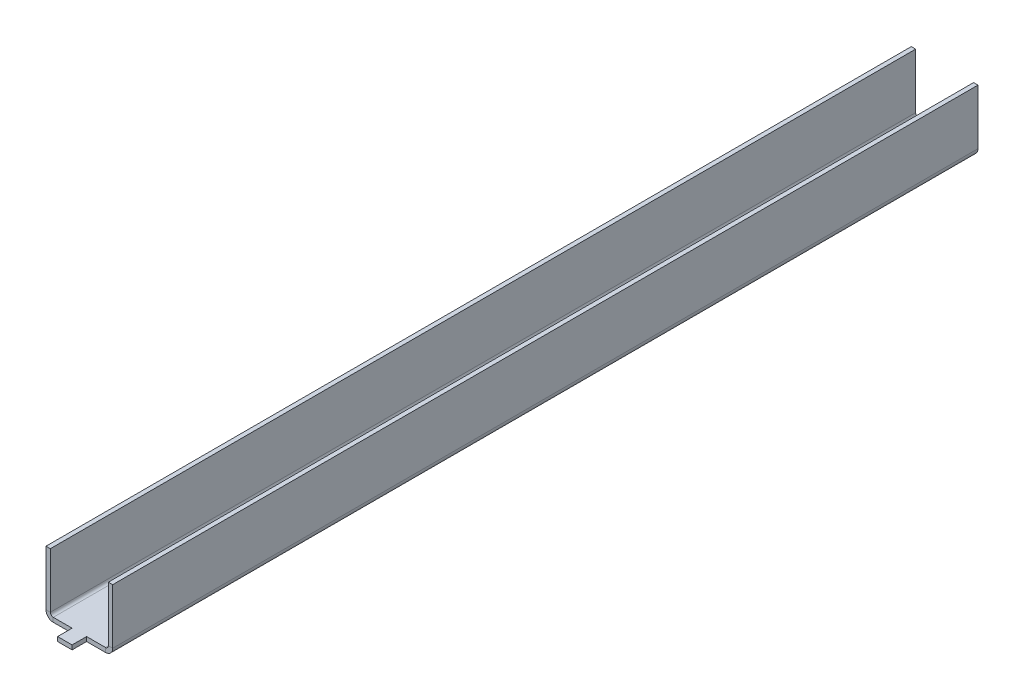
ISO-10303-21;
HEADER;
FILE_DESCRIPTION(('STEP AP214'),'2;1');
FILE_NAME('part.step','',(''),(''),'','','');
FILE_SCHEMA(('AUTOMOTIVE_DESIGN { 1 0 10303 214 1 1 1 1 }'));
ENDSEC;
DATA;
#1=APPLICATION_CONTEXT('core data for automotive mechanical design processes');
#2=APPLICATION_PROTOCOL_DEFINITION('international standard','automotive_design',2000,#1);
#3=PRODUCT_CONTEXT('',#1,'mechanical');
#4=PRODUCT('Part','Part','',(#3));
#5=PRODUCT_RELATED_PRODUCT_CATEGORY('part','',(#4));
#6=PRODUCT_DEFINITION_FORMATION('','',#4);
#7=PRODUCT_DEFINITION_CONTEXT('part definition',#1,'design');
#8=PRODUCT_DEFINITION('design','',#6,#7);
#9=PRODUCT_DEFINITION_SHAPE('','',#8);
#10=(LENGTH_UNIT() NAMED_UNIT(*) SI_UNIT(.MILLI.,.METRE.));
#11=(NAMED_UNIT(*) PLANE_ANGLE_UNIT() SI_UNIT($,.RADIAN.));
#12=(NAMED_UNIT(*) SI_UNIT($,.STERADIAN.) SOLID_ANGLE_UNIT());
#13=UNCERTAINTY_MEASURE_WITH_UNIT(LENGTH_MEASURE(1.E-05),#10,'distance_accuracy_value','');
#14=(GEOMETRIC_REPRESENTATION_CONTEXT(3) GLOBAL_UNCERTAINTY_ASSIGNED_CONTEXT((#13)) GLOBAL_UNIT_ASSIGNED_CONTEXT((#10,
#11,#12)) REPRESENTATION_CONTEXT('',''));
#15=CARTESIAN_POINT('',(0.,0.,0.));
#16=DIRECTION('',(0.,0.,1.));
#17=DIRECTION('',(1.,0.,0.));
#18=AXIS2_PLACEMENT_3D('',#15,#16,#17);
#19=CARTESIAN_POINT('',(586.708157751129,-1.49999999999958,1079.98412298286));
#20=DIRECTION('',(0.,1.,0.));
#21=DIRECTION('',(-1.,0.,0.));
#22=AXIS2_PLACEMENT_3D('',#19,#20,#21);
#23=PLANE('',#22);
#24=DIRECTION('',(0.,0.,1.));
#25=VECTOR('',#24,1.);
#26=CARTESIAN_POINT('',(-11.5,-1.49999999999983,1079.98412298286));
#27=LINE('',#26,#25);
#28=CARTESIAN_POINT('',(-11.4999999999997,-1.49999999999984,750.));
#29=VERTEX_POINT('',#28);
#30=CARTESIAN_POINT('',(-11.5,-1.49999999999983,1048.5));
#31=VERTEX_POINT('',#30);
#32=EDGE_CURVE('E251',#29,#31,#27,.T.);
#33=ORIENTED_EDGE('',*,*,#32,.T.);
#34=DIRECTION('',(-1.,0.,0.));
#35=VECTOR('',#34,1.);
#36=CARTESIAN_POINT('',(586.708157751129,-1.49999999999958,1048.5));
#37=LINE('',#36,#35);
#38=CARTESIAN_POINT('',(-9.99999999999979,-1.49999999999984,1048.5));
#39=VERTEX_POINT('',#38);
#40=EDGE_CURVE('E65',#39,#31,#37,.T.);
#41=ORIENTED_EDGE('',*,*,#40,.F.);
#42=DIRECTION('',(0.,0.,1.));
#43=VECTOR('',#42,1.);
#44=CARTESIAN_POINT('',(-10.,-1.49999999999983,1079.98412298286));
#45=LINE('',#44,#43);
#46=CARTESIAN_POINT('',(-9.99999999999999,-1.49999999999983,750.));
#47=VERTEX_POINT('',#46);
#48=EDGE_CURVE('E77',#39,#47,#45,.F.);
#49=ORIENTED_EDGE('',*,*,#48,.T.);
#50=DIRECTION('',(-1.,0.,0.));
#51=VECTOR('',#50,1.);
#52=CARTESIAN_POINT('',(586.708157751129,-1.49999999999958,750.));
#53=LINE('',#52,#51);
#54=EDGE_CURVE('E257',#47,#29,#53,.T.);
#55=ORIENTED_EDGE('',*,*,#54,.T.);
#56=EDGE_LOOP('',(#33,#41,#49,#55));
#57=FACE_BOUND('',#56,.T.);
#58=ADVANCED_FACE('F53',(#57),#23,.T.);
#59=CARTESIAN_POINT('',(586.708157751129,-22.9999999999996,750.));
#60=DIRECTION('',(0.,0.,-1.));
#61=DIRECTION('',(1.,0.,0.));
#62=AXIS2_PLACEMENT_3D('',#59,#60,#61);
#63=PLANE('',#62);
#64=DIRECTION('',(0.,1.,0.));
#65=VECTOR('',#64,1.);
#66=CARTESIAN_POINT('',(-11.5,-1.49999999999983,750.));
#67=LINE('',#66,#65);
#68=CARTESIAN_POINT('',(-11.5,-20.4999999999998,750.));
#69=VERTEX_POINT('',#68);
#70=EDGE_CURVE('E242',#69,#29,#67,.T.);
#71=ORIENTED_EDGE('',*,*,#70,.T.);
#72=ORIENTED_EDGE('',*,*,#54,.F.);
#73=DIRECTION('',(0.,1.,0.));
#74=VECTOR('',#73,1.);
#75=CARTESIAN_POINT('',(-9.99999999999999,-22.9999999999998,750.));
#76=LINE('',#75,#74);
#77=CARTESIAN_POINT('',(-9.99999999999999,-20.4999999999998,750.));
#78=VERTEX_POINT('',#77);
#79=EDGE_CURVE('E256',#47,#78,#76,.F.);
#80=ORIENTED_EDGE('',*,*,#79,.T.);
#81=DIRECTION('',(-1.,0.,0.));
#82=VECTOR('',#81,1.);
#83=CARTESIAN_POINT('',(586.708157751129,-20.4999999999996,750.));
#84=LINE('',#83,#82);
#85=EDGE_CURVE('E260',#78,#69,#84,.T.);
#86=ORIENTED_EDGE('',*,*,#85,.T.);
#87=EDGE_LOOP('',(#71,#72,#80,#86));
#88=FACE_BOUND('',#87,.T.);
#89=ADVANCED_FACE('F261',(#88),#63,.T.);
#90=CARTESIAN_POINT('',(-11.5,-1.49999999999983,1079.98412298286));
#91=DIRECTION('',(1.,0.,0.));
#92=DIRECTION('',(0.,1.,0.));
#93=AXIS2_PLACEMENT_3D('',#90,#91,#92);
#94=PLANE('',#93);
#95=ORIENTED_EDGE('',*,*,#32,.F.);
#96=ORIENTED_EDGE('',*,*,#70,.F.);
#97=DIRECTION('',(0.,0.,-1.));
#98=VECTOR('',#97,1.);
#99=CARTESIAN_POINT('',(-11.5,-20.4999999999998,1079.98412298286));
#100=LINE('',#99,#98);
#101=CARTESIAN_POINT('',(-11.5,-20.4999999999998,1048.5));
#102=VERTEX_POINT('',#101);
#103=EDGE_CURVE('E248',#102,#69,#100,.T.);
#104=ORIENTED_EDGE('',*,*,#103,.F.);
#105=DIRECTION('',(0.,1.,0.));
#106=VECTOR('',#105,1.);
#107=CARTESIAN_POINT('',(-11.5,-1.49999999999983,1048.5));
#108=LINE('',#107,#106);
#109=EDGE_CURVE('E266',#31,#102,#108,.F.);
#110=ORIENTED_EDGE('',*,*,#109,.F.);
#111=EDGE_LOOP('',(#95,#96,#104,#110));
#112=FACE_BOUND('',#111,.T.);
#113=ADVANCED_FACE('F245',(#112),#94,.F.);
#114=CARTESIAN_POINT('',(586.708157751129,-1.49999999999958,1048.5));
#115=DIRECTION('',(0.,0.,1.));
#116=DIRECTION('',(-1.,0.,0.));
#117=AXIS2_PLACEMENT_3D('',#114,#115,#116);
#118=PLANE('',#117);
#119=ORIENTED_EDGE('',*,*,#109,.T.);
#120=DIRECTION('',(-1.,0.,0.));
#121=VECTOR('',#120,1.);
#122=CARTESIAN_POINT('',(586.708157751129,-20.4999999999996,1048.5));
#123=LINE('',#122,#121);
#124=CARTESIAN_POINT('',(-9.99999999999999,-20.4999999999998,1048.5));
#125=VERTEX_POINT('',#124);
#126=EDGE_CURVE('E58',#125,#102,#123,.T.);
#127=ORIENTED_EDGE('',*,*,#126,.F.);
#128=DIRECTION('',(0.,1.,0.));
#129=VECTOR('',#128,1.);
#130=CARTESIAN_POINT('',(-9.99999999999999,-1.49999999999983,1048.5));
#131=LINE('',#130,#129);
#132=EDGE_CURVE('E98',#125,#39,#131,.T.);
#133=ORIENTED_EDGE('',*,*,#132,.T.);
#134=ORIENTED_EDGE('',*,*,#40,.T.);
#135=EDGE_LOOP('',(#119,#127,#133,#134));
#136=FACE_BOUND('',#135,.T.);
#137=ADVANCED_FACE('F482',(#136),#118,.T.);
#138=CARTESIAN_POINT('',(-10.,-1.49999999999983,1079.98412298286));
#139=DIRECTION('',(1.,0.,0.));
#140=DIRECTION('',(0.,1.,0.));
#141=AXIS2_PLACEMENT_3D('',#138,#139,#140);
#142=PLANE('',#141);
#143=DIRECTION('',(0.,0.,-1.));
#144=VECTOR('',#143,1.);
#145=CARTESIAN_POINT('',(-9.99999999999999,-20.4999999999998,1079.98412298286));
#146=LINE('',#145,#144);
#147=EDGE_CURVE('E12',#125,#78,#146,.T.);
#148=ORIENTED_EDGE('',*,*,#147,.T.);
#149=ORIENTED_EDGE('',*,*,#79,.F.);
#150=ORIENTED_EDGE('',*,*,#48,.F.);
#151=ORIENTED_EDGE('',*,*,#132,.F.);
#152=EDGE_LOOP('',(#148,#149,#150,#151));
#153=FACE_BOUND('',#152,.T.);
#154=ADVANCED_FACE('F56',(#153),#142,.T.);
#155=CARTESIAN_POINT('',(-10.,-21.4999999999998,1079.98412298286));
#156=DIRECTION('',(0.,1.,0.));
#157=DIRECTION('',(0.,0.,1.));
#158=AXIS2_PLACEMENT_3D('',#155,#156,#157);
#159=PLANE('',#158);
#160=DIRECTION('',(0.,0.,-1.));
#161=VECTOR('',#160,1.);
#162=CARTESIAN_POINT('',(9.,-21.4999999999998,1079.98412298286));
#163=LINE('',#162,#161);
#164=CARTESIAN_POINT('',(9.,-21.4999999999998,1048.5));
#165=VERTEX_POINT('',#164);
#166=CARTESIAN_POINT('',(9.,-21.4999999999998,750.));
#167=VERTEX_POINT('',#166);
#168=EDGE_CURVE('E548',#165,#167,#163,.T.);
#169=ORIENTED_EDGE('',*,*,#168,.T.);
#170=DIRECTION('',(-1.,0.,0.));
#171=VECTOR('',#170,1.);
#172=CARTESIAN_POINT('',(11.5,-21.4999999999998,750.));
#173=LINE('',#172,#171);
#174=CARTESIAN_POINT('',(2.5,-21.4999999999998,750.));
#175=VERTEX_POINT('',#174);
#176=EDGE_CURVE('E358',#175,#167,#173,.F.);
#177=ORIENTED_EDGE('',*,*,#176,.F.);
#178=DIRECTION('',(0.,0.,1.));
#179=VECTOR('',#178,1.);
#180=CARTESIAN_POINT('',(2.5,-21.4999999999998,750.));
#181=LINE('',#180,#179);
#182=CARTESIAN_POINT('',(2.5,-21.4999999999998,745.));
#183=VERTEX_POINT('',#182);
#184=EDGE_CURVE('E352',#183,#175,#181,.T.);
#185=ORIENTED_EDGE('',*,*,#184,.F.);
#186=DIRECTION('',(1.,0.,0.));
#187=VECTOR('',#186,1.);
#188=CARTESIAN_POINT('',(-2.5,-21.4999999999998,745.));
#189=LINE('',#188,#187);
#190=CARTESIAN_POINT('',(-2.5,-21.4999999999998,745.));
#191=VERTEX_POINT('',#190);
#192=EDGE_CURVE('E357',#191,#183,#189,.T.);
#193=ORIENTED_EDGE('',*,*,#192,.F.);
#194=DIRECTION('',(0.,0.,-1.));
#195=VECTOR('',#194,1.);
#196=CARTESIAN_POINT('',(-2.5,-21.4999999999998,750.));
#197=LINE('',#196,#195);
#198=CARTESIAN_POINT('',(-2.5,-21.4999999999998,750.));
#199=VERTEX_POINT('',#198);
#200=EDGE_CURVE('E364',#199,#191,#197,.T.);
#201=ORIENTED_EDGE('',*,*,#200,.F.);
#202=CARTESIAN_POINT('',(-8.99999999999999,-21.4999999999998,750.));
#203=VERTEX_POINT('',#202);
#204=EDGE_CURVE('E369',#203,#199,#173,.F.);
#205=ORIENTED_EDGE('',*,*,#204,.F.);
#206=DIRECTION('',(0.,0.,1.));
#207=VECTOR('',#206,1.);
#208=CARTESIAN_POINT('',(-9.,-21.4999999999998,1079.98412298286));
#209=LINE('',#208,#207);
#210=CARTESIAN_POINT('',(-9.,-21.4999999999998,1048.5));
#211=VERTEX_POINT('',#210);
#212=EDGE_CURVE('E370',#203,#211,#209,.T.);
#213=ORIENTED_EDGE('',*,*,#212,.T.);
#214=DIRECTION('',(1.,0.,0.));
#215=VECTOR('',#214,1.);
#216=CARTESIAN_POINT('',(-10.,-21.4999999999998,1048.5));
#217=LINE('',#216,#215);
#218=CARTESIAN_POINT('',(-2.5,-21.4999999999998,1048.5));
#219=VERTEX_POINT('',#218);
#220=EDGE_CURVE('E381',#219,#211,#217,.F.);
#221=ORIENTED_EDGE('',*,*,#220,.F.);
#222=DIRECTION('',(0.,0.,-1.));
#223=VECTOR('',#222,1.);
#224=CARTESIAN_POINT('',(-2.5,-21.4999999999998,1048.5));
#225=LINE('',#224,#223);
#226=CARTESIAN_POINT('',(-2.5,-21.4999999999998,1053.5));
#227=VERTEX_POINT('',#226);
#228=EDGE_CURVE('E376',#227,#219,#225,.T.);
#229=ORIENTED_EDGE('',*,*,#228,.F.);
#230=DIRECTION('',(-1.,0.,0.));
#231=VECTOR('',#230,1.);
#232=CARTESIAN_POINT('',(2.5,-21.4999999999998,1053.5));
#233=LINE('',#232,#231);
#234=CARTESIAN_POINT('',(2.5,-21.4999999999998,1053.5));
#235=VERTEX_POINT('',#234);
#236=EDGE_CURVE('E380',#235,#227,#233,.T.);
#237=ORIENTED_EDGE('',*,*,#236,.F.);
#238=DIRECTION('',(0.,0.,1.));
#239=VECTOR('',#238,1.);
#240=CARTESIAN_POINT('',(2.5,-21.4999999999998,1048.5));
#241=LINE('',#240,#239);
#242=CARTESIAN_POINT('',(2.5,-21.4999999999998,1048.5));
#243=VERTEX_POINT('',#242);
#244=EDGE_CURVE('E385',#243,#235,#241,.T.);
#245=ORIENTED_EDGE('',*,*,#244,.F.);
#246=EDGE_CURVE('E390',#165,#243,#217,.F.);
#247=ORIENTED_EDGE('',*,*,#246,.F.);
#248=EDGE_LOOP('',(#169,#177,#185,#193,#201,#205,#213,#221,#229,#237,#245,#247));
#249=FACE_BOUND('',#248,.T.);
#250=ADVANCED_FACE('F488',(#249),#159,.T.);
#251=CARTESIAN_POINT('',(11.5,595.04935078034,750.));
#252=DIRECTION('',(0.,0.,-1.));
#253=DIRECTION('',(0.,1.,0.));
#254=AXIS2_PLACEMENT_3D('',#251,#252,#253);
#255=PLANE('',#254);
#256=DIRECTION('',(1.,0.,0.));
#257=VECTOR('',#256,1.);
#258=CARTESIAN_POINT('',(-10.,-22.9999999999998,750.));
#259=LINE('',#258,#257);
#260=CARTESIAN_POINT('',(8.99999999999999,-22.9999999999998,750.));
#261=VERTEX_POINT('',#260);
#262=CARTESIAN_POINT('',(2.5,-22.9999999999998,750.));
#263=VERTEX_POINT('',#262);
#264=EDGE_CURVE('E113',#261,#263,#259,.F.);
#265=ORIENTED_EDGE('',*,*,#264,.T.);
#266=DIRECTION('',(0.,-1.,0.));
#267=VECTOR('',#266,1.);
#268=CARTESIAN_POINT('',(2.5,595.04935078034,750.));
#269=LINE('',#268,#267);
#270=EDGE_CURVE('E427',#175,#263,#269,.T.);
#271=ORIENTED_EDGE('',*,*,#270,.F.);
#272=ORIENTED_EDGE('',*,*,#176,.T.);
#273=DIRECTION('',(0.,-1.,0.));
#274=VECTOR('',#273,1.);
#275=CARTESIAN_POINT('',(9.,595.04935078034,750.));
#276=LINE('',#275,#274);
#277=EDGE_CURVE('E430',#167,#261,#276,.T.);
#278=ORIENTED_EDGE('',*,*,#277,.T.);
#279=EDGE_LOOP('',(#265,#271,#272,#278));
#280=FACE_BOUND('',#279,.T.);
#281=ADVANCED_FACE('F637',(#280),#255,.T.);
#282=CARTESIAN_POINT('',(2.5,595.04935078034,750.));
#283=DIRECTION('',(1.,0.,0.));
#284=DIRECTION('',(0.,1.,0.));
#285=AXIS2_PLACEMENT_3D('',#282,#283,#284);
#286=PLANE('',#285);
#287=DIRECTION('',(0.,0.,1.));
#288=VECTOR('',#287,1.);
#289=CARTESIAN_POINT('',(2.5,-22.9999999999998,750.));
#290=LINE('',#289,#288);
#291=CARTESIAN_POINT('',(2.5,-22.9999999999998,745.));
#292=VERTEX_POINT('',#291);
#293=EDGE_CURVE('E122',#292,#263,#290,.T.);
#294=ORIENTED_EDGE('',*,*,#293,.F.);
#295=DIRECTION('',(0.,-1.,0.));
#296=VECTOR('',#295,1.);
#297=CARTESIAN_POINT('',(2.5,595.04935078034,745.));
#298=LINE('',#297,#296);
#299=EDGE_CURVE('E424',#183,#292,#298,.T.);
#300=ORIENTED_EDGE('',*,*,#299,.F.);
#301=ORIENTED_EDGE('',*,*,#184,.T.);
#302=ORIENTED_EDGE('',*,*,#270,.T.);
#303=EDGE_LOOP('',(#294,#300,#301,#302));
#304=FACE_BOUND('',#303,.T.);
#305=ADVANCED_FACE('F497',(#304),#286,.T.);
#306=CARTESIAN_POINT('',(-2.5,595.04935078034,745.));
#307=DIRECTION('',(0.,0.,-1.));
#308=DIRECTION('',(0.,1.,0.));
#309=AXIS2_PLACEMENT_3D('',#306,#307,#308);
#310=PLANE('',#309);
#311=DIRECTION('',(1.,0.,0.));
#312=VECTOR('',#311,1.);
#313=CARTESIAN_POINT('',(-2.5,-22.9999999999998,745.));
#314=LINE('',#313,#312);
#315=CARTESIAN_POINT('',(-2.5,-22.9999999999998,745.));
#316=VERTEX_POINT('',#315);
#317=EDGE_CURVE('E316',#316,#292,#314,.T.);
#318=ORIENTED_EDGE('',*,*,#317,.F.);
#319=DIRECTION('',(0.,-1.,0.));
#320=VECTOR('',#319,1.);
#321=CARTESIAN_POINT('',(-2.5,595.04935078034,745.));
#322=LINE('',#321,#320);
#323=EDGE_CURVE('E420',#191,#316,#322,.T.);
#324=ORIENTED_EDGE('',*,*,#323,.F.);
#325=ORIENTED_EDGE('',*,*,#192,.T.);
#326=ORIENTED_EDGE('',*,*,#299,.T.);
#327=EDGE_LOOP('',(#318,#324,#325,#326));
#328=FACE_BOUND('',#327,.T.);
#329=ADVANCED_FACE('F688',(#328),#310,.T.);
#330=CARTESIAN_POINT('',(-2.5,595.04935078034,750.));
#331=DIRECTION('',(-1.,0.,0.));
#332=DIRECTION('',(0.,-1.,0.));
#333=AXIS2_PLACEMENT_3D('',#330,#331,#332);
#334=PLANE('',#333);
#335=DIRECTION('',(0.,0.,-1.));
#336=VECTOR('',#335,1.);
#337=CARTESIAN_POINT('',(-2.5,-22.9999999999998,750.));
#338=LINE('',#337,#336);
#339=CARTESIAN_POINT('',(-2.5,-22.9999999999998,750.));
#340=VERTEX_POINT('',#339);
#341=EDGE_CURVE('E311',#340,#316,#338,.T.);
#342=ORIENTED_EDGE('',*,*,#341,.F.);
#343=DIRECTION('',(0.,-1.,0.));
#344=VECTOR('',#343,1.);
#345=CARTESIAN_POINT('',(-2.5,595.04935078034,750.));
#346=LINE('',#345,#344);
#347=EDGE_CURVE('E416',#199,#340,#346,.T.);
#348=ORIENTED_EDGE('',*,*,#347,.F.);
#349=ORIENTED_EDGE('',*,*,#200,.T.);
#350=ORIENTED_EDGE('',*,*,#323,.T.);
#351=EDGE_LOOP('',(#342,#348,#349,#350));
#352=FACE_BOUND('',#351,.T.);
#353=ADVANCED_FACE('F682',(#352),#334,.T.);
#354=CARTESIAN_POINT('',(-8.99999999999999,-22.9999999999998,750.));
#355=VERTEX_POINT('',#354);
#356=EDGE_CURVE('E305',#340,#355,#259,.F.);
#357=ORIENTED_EDGE('',*,*,#356,.T.);
#358=DIRECTION('',(0.,-1.,0.));
#359=VECTOR('',#358,1.);
#360=CARTESIAN_POINT('',(-8.99999999999999,595.04935078034,750.));
#361=LINE('',#360,#359);
#362=EDGE_CURVE('E279',#203,#355,#361,.T.);
#363=ORIENTED_EDGE('',*,*,#362,.F.);
#364=ORIENTED_EDGE('',*,*,#204,.T.);
#365=ORIENTED_EDGE('',*,*,#347,.T.);
#366=EDGE_LOOP('',(#357,#363,#364,#365));
#367=FACE_BOUND('',#366,.T.);
#368=ADVANCED_FACE('F676',(#367),#255,.T.);
#369=CARTESIAN_POINT('',(-9.99999999999999,595.04935078034,1048.5));
#370=DIRECTION('',(0.,0.,1.));
#371=DIRECTION('',(0.,-1.,0.));
#372=AXIS2_PLACEMENT_3D('',#369,#370,#371);
#373=PLANE('',#372);
#374=DIRECTION('',(1.,0.,0.));
#375=VECTOR('',#374,1.);
#376=CARTESIAN_POINT('',(-10.,-22.9999999999998,1048.5));
#377=LINE('',#376,#375);
#378=CARTESIAN_POINT('',(-9.00000000000001,-22.9999999999998,1048.5));
#379=VERTEX_POINT('',#378);
#380=CARTESIAN_POINT('',(-2.5,-22.9999999999998,1048.5));
#381=VERTEX_POINT('',#380);
#382=EDGE_CURVE('E339',#379,#381,#377,.T.);
#383=ORIENTED_EDGE('',*,*,#382,.T.);
#384=DIRECTION('',(0.,-1.,0.));
#385=VECTOR('',#384,1.);
#386=CARTESIAN_POINT('',(-2.5,595.04935078034,1048.5));
#387=LINE('',#386,#385);
#388=EDGE_CURVE('E406',#219,#381,#387,.T.);
#389=ORIENTED_EDGE('',*,*,#388,.F.);
#390=ORIENTED_EDGE('',*,*,#220,.T.);
#391=DIRECTION('',(0.,-1.,0.));
#392=VECTOR('',#391,1.);
#393=CARTESIAN_POINT('',(-8.99999999999999,595.04935078034,1048.5));
#394=LINE('',#393,#392);
#395=EDGE_CURVE('E410',#211,#379,#394,.T.);
#396=ORIENTED_EDGE('',*,*,#395,.T.);
#397=EDGE_LOOP('',(#383,#389,#390,#396));
#398=FACE_BOUND('',#397,.T.);
#399=ADVANCED_FACE('F670',(#398),#373,.T.);
#400=CARTESIAN_POINT('',(-2.5,595.04935078034,1048.5));
#401=DIRECTION('',(-1.,0.,0.));
#402=DIRECTION('',(0.,-1.,0.));
#403=AXIS2_PLACEMENT_3D('',#400,#401,#402);
#404=PLANE('',#403);
#405=DIRECTION('',(0.,0.,-1.));
#406=VECTOR('',#405,1.);
#407=CARTESIAN_POINT('',(-2.5,-22.9999999999998,1048.5));
#408=LINE('',#407,#406);
#409=CARTESIAN_POINT('',(-2.5,-22.9999999999998,1053.5));
#410=VERTEX_POINT('',#409);
#411=EDGE_CURVE('E570',#410,#381,#408,.T.);
#412=ORIENTED_EDGE('',*,*,#411,.F.);
#413=DIRECTION('',(0.,-1.,0.));
#414=VECTOR('',#413,1.);
#415=CARTESIAN_POINT('',(-2.5,595.04935078034,1053.5));
#416=LINE('',#415,#414);
#417=EDGE_CURVE('E402',#227,#410,#416,.T.);
#418=ORIENTED_EDGE('',*,*,#417,.F.);
#419=ORIENTED_EDGE('',*,*,#228,.T.);
#420=ORIENTED_EDGE('',*,*,#388,.T.);
#421=EDGE_LOOP('',(#412,#418,#419,#420));
#422=FACE_BOUND('',#421,.T.);
#423=ADVANCED_FACE('F593',(#422),#404,.T.);
#424=CARTESIAN_POINT('',(2.5,595.04935078034,1053.5));
#425=DIRECTION('',(0.,0.,1.));
#426=DIRECTION('',(0.,-1.,0.));
#427=AXIS2_PLACEMENT_3D('',#424,#425,#426);
#428=PLANE('',#427);
#429=DIRECTION('',(-1.,0.,0.));
#430=VECTOR('',#429,1.);
#431=CARTESIAN_POINT('',(2.5,-22.9999999999998,1053.5));
#432=LINE('',#431,#430);
#433=CARTESIAN_POINT('',(2.5,-22.9999999999998,1053.5));
#434=VERTEX_POINT('',#433);
#435=EDGE_CURVE('E574',#434,#410,#432,.T.);
#436=ORIENTED_EDGE('',*,*,#435,.F.);
#437=DIRECTION('',(0.,-1.,0.));
#438=VECTOR('',#437,1.);
#439=CARTESIAN_POINT('',(2.5,595.04935078034,1053.5));
#440=LINE('',#439,#438);
#441=EDGE_CURVE('E398',#235,#434,#440,.T.);
#442=ORIENTED_EDGE('',*,*,#441,.F.);
#443=ORIENTED_EDGE('',*,*,#236,.T.);
#444=ORIENTED_EDGE('',*,*,#417,.T.);
#445=EDGE_LOOP('',(#436,#442,#443,#444));
#446=FACE_BOUND('',#445,.T.);
#447=ADVANCED_FACE('F590',(#446),#428,.T.);
#448=CARTESIAN_POINT('',(2.5,595.04935078034,1048.5));
#449=DIRECTION('',(1.,0.,0.));
#450=DIRECTION('',(0.,1.,0.));
#451=AXIS2_PLACEMENT_3D('',#448,#449,#450);
#452=PLANE('',#451);
#453=DIRECTION('',(0.,0.,1.));
#454=VECTOR('',#453,1.);
#455=CARTESIAN_POINT('',(2.5,-22.9999999999998,1048.5));
#456=LINE('',#455,#454);
#457=CARTESIAN_POINT('',(2.5,-22.9999999999998,1048.5));
#458=VERTEX_POINT('',#457);
#459=EDGE_CURVE('E338',#458,#434,#456,.T.);
#460=ORIENTED_EDGE('',*,*,#459,.F.);
#461=DIRECTION('',(0.,-1.,0.));
#462=VECTOR('',#461,1.);
#463=CARTESIAN_POINT('',(2.5,595.04935078034,1048.5));
#464=LINE('',#463,#462);
#465=EDGE_CURVE('E395',#243,#458,#464,.T.);
#466=ORIENTED_EDGE('',*,*,#465,.F.);
#467=ORIENTED_EDGE('',*,*,#244,.T.);
#468=ORIENTED_EDGE('',*,*,#441,.T.);
#469=EDGE_LOOP('',(#460,#466,#467,#468));
#470=FACE_BOUND('',#469,.T.);
#471=ADVANCED_FACE('F587',(#470),#452,.T.);
#472=CARTESIAN_POINT('',(9.,-22.9999999999998,1048.5));
#473=VERTEX_POINT('',#472);
#474=EDGE_CURVE('E334',#458,#473,#377,.T.);
#475=ORIENTED_EDGE('',*,*,#474,.T.);
#476=DIRECTION('',(0.,-1.,0.));
#477=VECTOR('',#476,1.);
#478=CARTESIAN_POINT('',(9.,595.04935078034,1048.5));
#479=LINE('',#478,#477);
#480=EDGE_CURVE('E391',#165,#473,#479,.T.);
#481=ORIENTED_EDGE('',*,*,#480,.F.);
#482=ORIENTED_EDGE('',*,*,#246,.T.);
#483=ORIENTED_EDGE('',*,*,#465,.T.);
#484=EDGE_LOOP('',(#475,#481,#482,#483));
#485=FACE_BOUND('',#484,.T.);
#486=ADVANCED_FACE('F633',(#485),#373,.T.);
#487=CARTESIAN_POINT('',(-10.,-22.9999999999998,1079.98412298286));
#488=DIRECTION('',(0.,1.,0.));
#489=DIRECTION('',(0.,0.,1.));
#490=AXIS2_PLACEMENT_3D('',#487,#488,#489);
#491=PLANE('',#490);
#492=DIRECTION('',(0.,0.,1.));
#493=VECTOR('',#492,1.);
#494=CARTESIAN_POINT('',(-9.,-22.9999999999998,1079.98412298286));
#495=LINE('',#494,#493);
#496=EDGE_CURVE('E300',#355,#379,#495,.T.);
#497=ORIENTED_EDGE('',*,*,#496,.F.);
#498=ORIENTED_EDGE('',*,*,#356,.F.);
#499=ORIENTED_EDGE('',*,*,#341,.T.);
#500=ORIENTED_EDGE('',*,*,#317,.T.);
#501=ORIENTED_EDGE('',*,*,#293,.T.);
#502=ORIENTED_EDGE('',*,*,#264,.F.);
#503=DIRECTION('',(0.,0.,-1.));
#504=VECTOR('',#503,1.);
#505=CARTESIAN_POINT('',(9.00000000000001,-22.9999999999998,1079.98412298286));
#506=LINE('',#505,#504);
#507=EDGE_CURVE('E330',#473,#261,#506,.T.);
#508=ORIENTED_EDGE('',*,*,#507,.F.);
#509=ORIENTED_EDGE('',*,*,#474,.F.);
#510=ORIENTED_EDGE('',*,*,#459,.T.);
#511=ORIENTED_EDGE('',*,*,#435,.T.);
#512=ORIENTED_EDGE('',*,*,#411,.T.);
#513=ORIENTED_EDGE('',*,*,#382,.F.);
#514=EDGE_LOOP('',(#497,#498,#499,#500,#501,#502,#508,#509,#510,#511,#512,#513));
#515=FACE_BOUND('',#514,.T.);
#516=ADVANCED_FACE('F503',(#515),#491,.F.);
#517=CARTESIAN_POINT('',(-586.708157751129,-1.49999999999978,1079.98412298286));
#518=DIRECTION('',(0.,1.,0.));
#519=DIRECTION('',(-1.,0.,0.));
#520=AXIS2_PLACEMENT_3D('',#517,#518,#519);
#521=PLANE('',#520);
#522=DIRECTION('',(0.,0.,1.));
#523=VECTOR('',#522,1.);
#524=CARTESIAN_POINT('',(11.5,-1.49999999999983,1079.98412298286));
#525=LINE('',#524,#523);
#526=CARTESIAN_POINT('',(11.4999999999997,-1.49999999999983,1048.5));
#527=VERTEX_POINT('',#526);
#528=CARTESIAN_POINT('',(11.4999999999997,-1.49999999999983,750.));
#529=VERTEX_POINT('',#528);
#530=EDGE_CURVE('E461',#527,#529,#525,.F.);
#531=ORIENTED_EDGE('',*,*,#530,.T.);
#532=DIRECTION('',(1.,0.,0.));
#533=VECTOR('',#532,1.);
#534=CARTESIAN_POINT('',(-586.708157751129,-1.49999999999978,750.));
#535=LINE('',#534,#533);
#536=CARTESIAN_POINT('',(10.,-1.49999999999983,750.));
#537=VERTEX_POINT('',#536);
#538=EDGE_CURVE('E606',#537,#529,#535,.T.);
#539=ORIENTED_EDGE('',*,*,#538,.F.);
#540=DIRECTION('',(0.,0.,1.));
#541=VECTOR('',#540,1.);
#542=CARTESIAN_POINT('',(10.,-1.49999999999983,1079.98412298286));
#543=LINE('',#542,#541);
#544=CARTESIAN_POINT('',(10.,-1.49999999999983,1048.5));
#545=VERTEX_POINT('',#544);
#546=EDGE_CURVE('E456',#537,#545,#543,.T.);
#547=ORIENTED_EDGE('',*,*,#546,.T.);
#548=DIRECTION('',(1.,0.,0.));
#549=VECTOR('',#548,1.);
#550=CARTESIAN_POINT('',(-586.708157751129,-1.49999999999978,1048.5));
#551=LINE('',#550,#549);
#552=EDGE_CURVE('E450',#545,#527,#551,.T.);
#553=ORIENTED_EDGE('',*,*,#552,.T.);
#554=EDGE_LOOP('',(#531,#539,#547,#553));
#555=FACE_BOUND('',#554,.T.);
#556=ADVANCED_FACE('F661',(#555),#521,.T.);
#557=CARTESIAN_POINT('',(-586.708157751129,-20.4999999999998,750.));
#558=DIRECTION('',(0.,0.,-1.));
#559=DIRECTION('',(-1.,0.,0.));
#560=AXIS2_PLACEMENT_3D('',#557,#558,#559);
#561=PLANE('',#560);
#562=DIRECTION('',(0.,-1.,0.));
#563=VECTOR('',#562,1.);
#564=CARTESIAN_POINT('',(11.5,-21.4999999999998,750.));
#565=LINE('',#564,#563);
#566=CARTESIAN_POINT('',(11.5,-20.4999999999998,750.));
#567=VERTEX_POINT('',#566);
#568=EDGE_CURVE('E443',#529,#567,#565,.T.);
#569=ORIENTED_EDGE('',*,*,#568,.T.);
#570=DIRECTION('',(1.,0.,0.));
#571=VECTOR('',#570,1.);
#572=CARTESIAN_POINT('',(-586.708157751129,-20.4999999999998,750.));
#573=LINE('',#572,#571);
#574=CARTESIAN_POINT('',(10.,-20.4999999999998,750.));
#575=VERTEX_POINT('',#574);
#576=EDGE_CURVE('E307',#575,#567,#573,.T.);
#577=ORIENTED_EDGE('',*,*,#576,.F.);
#578=DIRECTION('',(0.,1.,0.));
#579=VECTOR('',#578,1.);
#580=CARTESIAN_POINT('',(10.,-20.4999999999998,750.));
#581=LINE('',#580,#579);
#582=EDGE_CURVE('E449',#575,#537,#581,.T.);
#583=ORIENTED_EDGE('',*,*,#582,.T.);
#584=ORIENTED_EDGE('',*,*,#538,.T.);
#585=EDGE_LOOP('',(#569,#577,#583,#584));
#586=FACE_BOUND('',#585,.T.);
#587=ADVANCED_FACE('F641',(#586),#561,.T.);
#588=CARTESIAN_POINT('',(10.,-21.4999999999998,1079.98412298286));
#589=DIRECTION('',(-1.,0.,0.));
#590=DIRECTION('',(0.,-1.,0.));
#591=AXIS2_PLACEMENT_3D('',#588,#589,#590);
#592=PLANE('',#591);
#593=ORIENTED_EDGE('',*,*,#546,.F.);
#594=ORIENTED_EDGE('',*,*,#582,.F.);
#595=DIRECTION('',(0.,0.,1.));
#596=VECTOR('',#595,1.);
#597=CARTESIAN_POINT('',(10.,-20.4999999999998,1079.98412298286));
#598=LINE('',#597,#596);
#599=CARTESIAN_POINT('',(9.99999999999979,-20.4999999999998,1048.5));
#600=VERTEX_POINT('',#599);
#601=EDGE_CURVE('E551',#575,#600,#598,.T.);
#602=ORIENTED_EDGE('',*,*,#601,.T.);
#603=DIRECTION('',(0.,1.,0.));
#604=VECTOR('',#603,1.);
#605=CARTESIAN_POINT('',(10.,-21.4999999999998,1048.5));
#606=LINE('',#605,#604);
#607=EDGE_CURVE('E651',#545,#600,#606,.F.);
#608=ORIENTED_EDGE('',*,*,#607,.F.);
#609=EDGE_LOOP('',(#593,#594,#602,#608));
#610=FACE_BOUND('',#609,.T.);
#611=ADVANCED_FACE('F508',(#610),#592,.T.);
#612=CARTESIAN_POINT('',(-586.708157751129,-21.4999999999998,1048.5));
#613=DIRECTION('',(0.,0.,1.));
#614=DIRECTION('',(1.,0.,0.));
#615=AXIS2_PLACEMENT_3D('',#612,#613,#614);
#616=PLANE('',#615);
#617=DIRECTION('',(0.,-1.,0.));
#618=VECTOR('',#617,1.);
#619=CARTESIAN_POINT('',(11.5,-21.4999999999998,1048.5));
#620=LINE('',#619,#618);
#621=CARTESIAN_POINT('',(11.5,-20.4999999999998,1048.5));
#622=VERTEX_POINT('',#621);
#623=EDGE_CURVE('E647',#622,#527,#620,.F.);
#624=ORIENTED_EDGE('',*,*,#623,.T.);
#625=ORIENTED_EDGE('',*,*,#552,.F.);
#626=ORIENTED_EDGE('',*,*,#607,.T.);
#627=DIRECTION('',(1.,0.,0.));
#628=VECTOR('',#627,1.);
#629=CARTESIAN_POINT('',(-586.708157751129,-20.4999999999998,1048.5));
#630=LINE('',#629,#628);
#631=EDGE_CURVE('E306',#600,#622,#630,.T.);
#632=ORIENTED_EDGE('',*,*,#631,.T.);
#633=EDGE_LOOP('',(#624,#625,#626,#632));
#634=FACE_BOUND('',#633,.T.);
#635=ADVANCED_FACE('F658',(#634),#616,.T.);
#636=CARTESIAN_POINT('',(11.5,-21.4999999999998,1079.98412298286));
#637=DIRECTION('',(-1.,0.,0.));
#638=DIRECTION('',(0.,-1.,0.));
#639=AXIS2_PLACEMENT_3D('',#636,#637,#638);
#640=PLANE('',#639);
#641=DIRECTION('',(0.,0.,1.));
#642=VECTOR('',#641,1.);
#643=CARTESIAN_POINT('',(11.5,-20.4999999999998,1079.98412298286));
#644=LINE('',#643,#642);
#645=EDGE_CURVE('E616',#567,#622,#644,.T.);
#646=ORIENTED_EDGE('',*,*,#645,.F.);
#647=ORIENTED_EDGE('',*,*,#568,.F.);
#648=ORIENTED_EDGE('',*,*,#530,.F.);
#649=ORIENTED_EDGE('',*,*,#623,.F.);
#650=EDGE_LOOP('',(#646,#647,#648,#649));
#651=FACE_BOUND('',#650,.T.);
#652=ADVANCED_FACE('F512',(#651),#640,.F.);
#653=CARTESIAN_POINT('',(9.,-20.4999999999998,1048.5));
#654=DIRECTION('',(0.,0.,1.));
#655=DIRECTION('',(1.,0.,0.));
#656=AXIS2_PLACEMENT_3D('',#653,#654,#655);
#657=PLANE('',#656);
#658=ORIENTED_EDGE('',*,*,#631,.F.);
#659=CARTESIAN_POINT('',(9.,-20.4999999999998,1048.5));
#660=DIRECTION('',(0.,0.,1.));
#661=DIRECTION('',(1.,0.,0.));
#662=AXIS2_PLACEMENT_3D('',#659,#660,#661);
#663=CIRCLE('',#662,1.);
#664=EDGE_CURVE('E556',#600,#165,#663,.F.);
#665=ORIENTED_EDGE('',*,*,#664,.T.);
#666=ORIENTED_EDGE('',*,*,#480,.T.);
#667=CARTESIAN_POINT('',(9.,-20.4999999999998,1048.5));
#668=DIRECTION('',(0.,0.,1.));
#669=DIRECTION('',(1.,0.,0.));
#670=AXIS2_PLACEMENT_3D('',#667,#668,#669);
#671=CIRCLE('',#670,2.5);
#672=EDGE_CURVE('E563',#622,#473,#671,.F.);
#673=ORIENTED_EDGE('',*,*,#672,.F.);
#674=EDGE_LOOP('',(#658,#665,#666,#673));
#675=FACE_BOUND('',#674,.T.);
#676=ADVANCED_FACE('F528',(#675),#657,.T.);
#677=CARTESIAN_POINT('',(9.,-20.4999999999998,750.));
#678=DIRECTION('',(0.,0.,-1.));
#679=DIRECTION('',(-1.,0.,0.));
#680=AXIS2_PLACEMENT_3D('',#677,#678,#679);
#681=PLANE('',#680);
#682=ORIENTED_EDGE('',*,*,#277,.F.);
#683=CARTESIAN_POINT('',(9.,-20.4999999999998,750.));
#684=DIRECTION('',(0.,0.,1.));
#685=DIRECTION('',(1.,0.,0.));
#686=AXIS2_PLACEMENT_3D('',#683,#684,#685);
#687=CIRCLE('',#686,1.);
#688=EDGE_CURVE('E285',#167,#575,#687,.T.);
#689=ORIENTED_EDGE('',*,*,#688,.T.);
#690=ORIENTED_EDGE('',*,*,#576,.T.);
#691=CARTESIAN_POINT('',(9.,-20.4999999999998,750.));
#692=DIRECTION('',(0.,0.,1.));
#693=DIRECTION('',(1.,0.,0.));
#694=AXIS2_PLACEMENT_3D('',#691,#692,#693);
#695=CIRCLE('',#694,2.5);
#696=EDGE_CURVE('E559',#261,#567,#695,.T.);
#697=ORIENTED_EDGE('',*,*,#696,.F.);
#698=EDGE_LOOP('',(#682,#689,#690,#697));
#699=FACE_BOUND('',#698,.T.);
#700=ADVANCED_FACE('F532',(#699),#681,.T.);
#701=CARTESIAN_POINT('',(9.,-20.4999999999998,435.6007951664));
#702=DIRECTION('',(0.,0.,1.));
#703=DIRECTION('',(1.,0.,0.));
#704=AXIS2_PLACEMENT_3D('',#701,#702,#703);
#705=CYLINDRICAL_SURFACE('',#704,2.5);
#706=ORIENTED_EDGE('',*,*,#696,.T.);
#707=ORIENTED_EDGE('',*,*,#645,.T.);
#708=ORIENTED_EDGE('',*,*,#672,.T.);
#709=ORIENTED_EDGE('',*,*,#507,.T.);
#710=EDGE_LOOP('',(#706,#707,#708,#709));
#711=FACE_BOUND('',#710,.T.);
#712=ADVANCED_FACE('F535',(#711),#705,.T.);
#713=CARTESIAN_POINT('',(9.,-20.4999999999998,435.6007951664));
#714=DIRECTION('',(0.,0.,1.));
#715=DIRECTION('',(1.,0.,0.));
#716=AXIS2_PLACEMENT_3D('',#713,#714,#715);
#717=CYLINDRICAL_SURFACE('',#716,1.);
#718=ORIENTED_EDGE('',*,*,#688,.F.);
#719=ORIENTED_EDGE('',*,*,#168,.F.);
#720=ORIENTED_EDGE('',*,*,#664,.F.);
#721=ORIENTED_EDGE('',*,*,#601,.F.);
#722=EDGE_LOOP('',(#718,#719,#720,#721));
#723=FACE_BOUND('',#722,.T.);
#724=ADVANCED_FACE('F536',(#723),#717,.F.);
#725=CARTESIAN_POINT('',(-8.99999999999999,-20.4999999999998,1048.5));
#726=DIRECTION('',(0.,0.,1.));
#727=DIRECTION('',(0.,-1.,0.));
#728=AXIS2_PLACEMENT_3D('',#725,#726,#727);
#729=PLANE('',#728);
#730=ORIENTED_EDGE('',*,*,#395,.F.);
#731=CARTESIAN_POINT('',(-8.99999999999999,-20.4999999999998,1048.5));
#732=DIRECTION('',(0.,0.,1.));
#733=DIRECTION('',(0.,-1.,0.));
#734=AXIS2_PLACEMENT_3D('',#731,#732,#733);
#735=CIRCLE('',#734,1.);
#736=EDGE_CURVE('E281',#211,#125,#735,.F.);
#737=ORIENTED_EDGE('',*,*,#736,.T.);
#738=ORIENTED_EDGE('',*,*,#126,.T.);
#739=CARTESIAN_POINT('',(-8.99999999999999,-20.4999999999998,1048.5));
#740=DIRECTION('',(0.,0.,1.));
#741=DIRECTION('',(0.,-1.,0.));
#742=AXIS2_PLACEMENT_3D('',#739,#740,#741);
#743=CIRCLE('',#742,2.5);
#744=EDGE_CURVE('E275',#379,#102,#743,.F.);
#745=ORIENTED_EDGE('',*,*,#744,.F.);
#746=EDGE_LOOP('',(#730,#737,#738,#745));
#747=FACE_BOUND('',#746,.T.);
#748=ADVANCED_FACE('F517',(#747),#729,.T.);
#749=CARTESIAN_POINT('',(-8.99999999999999,-20.4999999999998,750.));
#750=DIRECTION('',(0.,0.,-1.));
#751=DIRECTION('',(0.,1.,0.));
#752=AXIS2_PLACEMENT_3D('',#749,#750,#751);
#753=PLANE('',#752);
#754=ORIENTED_EDGE('',*,*,#85,.F.);
#755=CARTESIAN_POINT('',(-8.99999999999999,-20.4999999999998,750.));
#756=DIRECTION('',(0.,0.,1.));
#757=DIRECTION('',(0.,-1.,0.));
#758=AXIS2_PLACEMENT_3D('',#755,#756,#757);
#759=CIRCLE('',#758,1.);
#760=EDGE_CURVE('E288',#78,#203,#759,.T.);
#761=ORIENTED_EDGE('',*,*,#760,.T.);
#762=ORIENTED_EDGE('',*,*,#362,.T.);
#763=CARTESIAN_POINT('',(-8.99999999999999,-20.4999999999998,750.));
#764=DIRECTION('',(0.,0.,1.));
#765=DIRECTION('',(0.,-1.,0.));
#766=AXIS2_PLACEMENT_3D('',#763,#764,#765);
#767=CIRCLE('',#766,2.5);
#768=EDGE_CURVE('E273',#69,#355,#767,.T.);
#769=ORIENTED_EDGE('',*,*,#768,.F.);
#770=EDGE_LOOP('',(#754,#761,#762,#769));
#771=FACE_BOUND('',#770,.T.);
#772=ADVANCED_FACE('F277',(#771),#753,.T.);
#773=CARTESIAN_POINT('',(-8.99999999999999,-20.4999999999998,437.93952509169));
#774=DIRECTION('',(0.,0.,1.));
#775=DIRECTION('',(0.,-1.,0.));
#776=AXIS2_PLACEMENT_3D('',#773,#774,#775);
#777=CYLINDRICAL_SURFACE('',#776,2.5);
#778=ORIENTED_EDGE('',*,*,#768,.T.);
#779=ORIENTED_EDGE('',*,*,#496,.T.);
#780=ORIENTED_EDGE('',*,*,#744,.T.);
#781=ORIENTED_EDGE('',*,*,#103,.T.);
#782=EDGE_LOOP('',(#778,#779,#780,#781));
#783=FACE_BOUND('',#782,.T.);
#784=ADVANCED_FACE('F271',(#783),#777,.T.);
#785=CARTESIAN_POINT('',(-8.99999999999999,-20.4999999999998,437.93952509169));
#786=DIRECTION('',(0.,0.,1.));
#787=DIRECTION('',(0.,-1.,0.));
#788=AXIS2_PLACEMENT_3D('',#785,#786,#787);
#789=CYLINDRICAL_SURFACE('',#788,1.);
#790=ORIENTED_EDGE('',*,*,#760,.F.);
#791=ORIENTED_EDGE('',*,*,#147,.F.);
#792=ORIENTED_EDGE('',*,*,#736,.F.);
#793=ORIENTED_EDGE('',*,*,#212,.F.);
#794=EDGE_LOOP('',(#790,#791,#792,#793));
#795=FACE_BOUND('',#794,.T.);
#796=ADVANCED_FACE('F525',(#795),#789,.F.);
#797=CLOSED_SHELL('',(#58,#89,#113,#137,#154,#250,#281,#305,#329,#353,#368,#399,#423,#447,#471,
#486,#516,#556,#587,#611,#635,#652,#676,#700,#712,#724,#748,#772,#784,#796));
#798=MANIFOLD_SOLID_BREP('B2',#797);
#799=ADVANCED_BREP_SHAPE_REPRESENTATION('',(#18,#798),#14);
#800=SHAPE_DEFINITION_REPRESENTATION(#9,#799);
ENDSEC;
END-ISO-10303-21;
